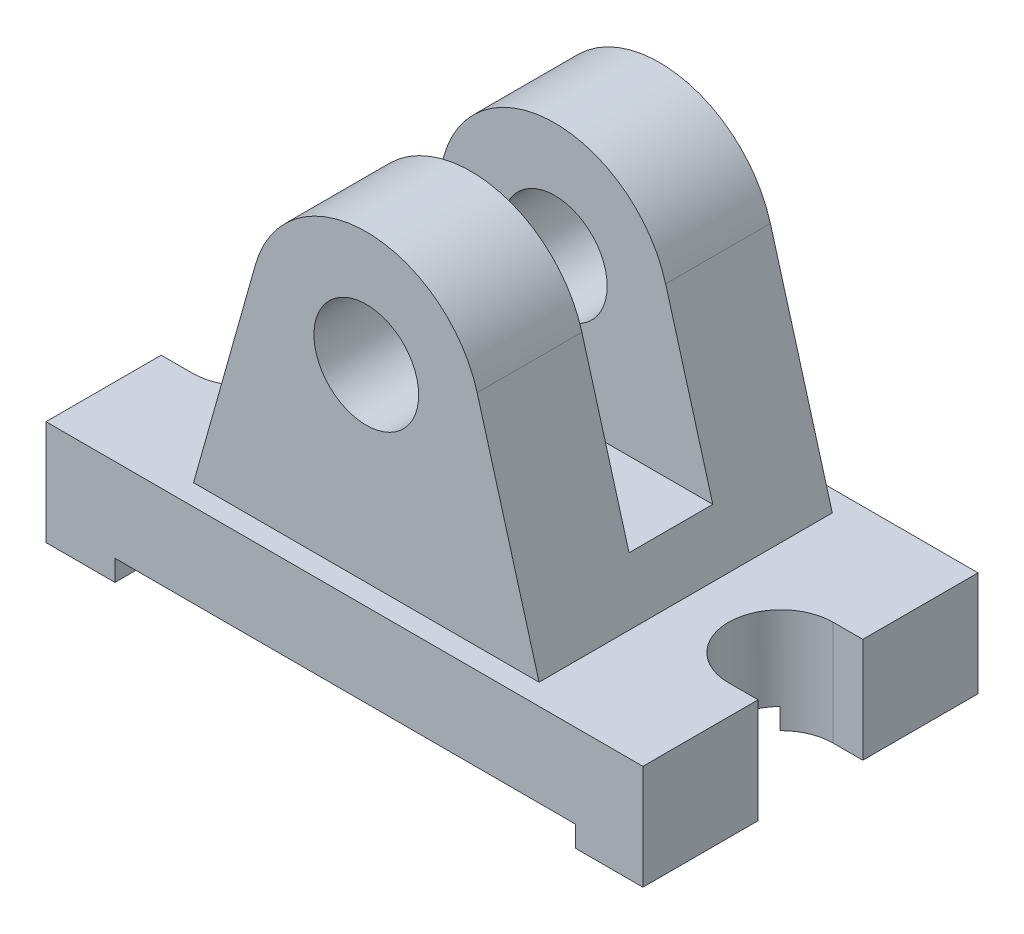
ISO-10303-21;
HEADER;
FILE_DESCRIPTION(('STEP AP214'),'2;1');
FILE_NAME('part.step','',(''),(''),'','','');
FILE_SCHEMA(('AUTOMOTIVE_DESIGN { 1 0 10303 214 1 1 1 1 }'));
ENDSEC;
DATA;
#1=APPLICATION_CONTEXT('core data for automotive mechanical design processes');
#2=APPLICATION_PROTOCOL_DEFINITION('international standard','automotive_design',2000,#1);
#3=PRODUCT_CONTEXT('',#1,'mechanical');
#4=PRODUCT('Part','Part','',(#3));
#5=PRODUCT_RELATED_PRODUCT_CATEGORY('part','',(#4));
#6=PRODUCT_DEFINITION_FORMATION('','',#4);
#7=PRODUCT_DEFINITION_CONTEXT('part definition',#1,'design');
#8=PRODUCT_DEFINITION('design','',#6,#7);
#9=PRODUCT_DEFINITION_SHAPE('','',#8);
#10=(LENGTH_UNIT() NAMED_UNIT(*) SI_UNIT(.MILLI.,.METRE.));
#11=(NAMED_UNIT(*) PLANE_ANGLE_UNIT() SI_UNIT($,.RADIAN.));
#12=(NAMED_UNIT(*) SI_UNIT($,.STERADIAN.) SOLID_ANGLE_UNIT());
#13=UNCERTAINTY_MEASURE_WITH_UNIT(LENGTH_MEASURE(1.E-05),#10,'distance_accuracy_value','');
#14=(GEOMETRIC_REPRESENTATION_CONTEXT(3) GLOBAL_UNCERTAINTY_ASSIGNED_CONTEXT((#13)) GLOBAL_UNIT_ASSIGNED_CONTEXT((#10,
#11,#12)) REPRESENTATION_CONTEXT('',''));
#15=CARTESIAN_POINT('',(0.,0.,0.));
#16=DIRECTION('',(0.,0.,1.));
#17=DIRECTION('',(1.,0.,0.));
#18=AXIS2_PLACEMENT_3D('',#15,#16,#17);
#19=CARTESIAN_POINT('',(0.,28.,-14.));
#20=DIRECTION('',(0.,0.,1.));
#21=DIRECTION('',(1.,0.,0.));
#22=AXIS2_PLACEMENT_3D('',#19,#20,#21);
#23=CYLINDRICAL_SURFACE('',#22,11.);
#24=CARTESIAN_POINT('',(0.,28.,4.));
#25=DIRECTION('',(0.,0.,-1.));
#26=DIRECTION('',(0.,1.,0.));
#27=AXIS2_PLACEMENT_3D('',#24,#25,#26);
#28=CIRCLE('',#27,11.);
#29=CARTESIAN_POINT('',(10.5877491196732,30.9832144708115,4.));
#30=VERTEX_POINT('',#29);
#31=CARTESIAN_POINT('',(-10.5877491196732,30.9832144708115,4.));
#32=VERTEX_POINT('',#31);
#33=EDGE_CURVE('E54',#30,#32,#28,.F.);
#34=ORIENTED_EDGE('',*,*,#33,.T.);
#35=DIRECTION('',(0.,0.,1.));
#36=VECTOR('',#35,1.);
#37=CARTESIAN_POINT('',(-10.5877491196732,30.9832144708115,-14.));
#38=LINE('',#37,#36);
#39=CARTESIAN_POINT('',(-10.5877491196732,30.9832144708115,14.));
#40=VERTEX_POINT('',#39);
#41=EDGE_CURVE('E304',#32,#40,#38,.T.);
#42=ORIENTED_EDGE('',*,*,#41,.T.);
#43=CARTESIAN_POINT('',(0.,28.,14.));
#44=DIRECTION('',(0.,0.,1.));
#45=DIRECTION('',(1.,0.,0.));
#46=AXIS2_PLACEMENT_3D('',#43,#44,#45);
#47=CIRCLE('',#46,11.);
#48=CARTESIAN_POINT('',(10.5877491196732,30.9832144708115,14.));
#49=VERTEX_POINT('',#48);
#50=EDGE_CURVE('E311',#49,#40,#47,.T.);
#51=ORIENTED_EDGE('',*,*,#50,.F.);
#52=DIRECTION('',(0.,0.,1.));
#53=VECTOR('',#52,1.);
#54=CARTESIAN_POINT('',(10.5877491196732,30.9832144708115,-14.));
#55=LINE('',#54,#53);
#56=EDGE_CURVE('E332',#30,#49,#55,.T.);
#57=ORIENTED_EDGE('',*,*,#56,.F.);
#58=EDGE_LOOP('',(#34,#42,#51,#57));
#59=FACE_BOUND('',#58,.T.);
#60=ADVANCED_FACE('F39',(#59),#23,.T.);
#61=CARTESIAN_POINT('',(0.,28.,-14.));
#62=DIRECTION('',(0.,0.,1.));
#63=DIRECTION('',(1.,0.,0.));
#64=AXIS2_PLACEMENT_3D('',#61,#62,#63);
#65=CYLINDRICAL_SURFACE('',#64,5.);
#66=CARTESIAN_POINT('',(0.,28.,14.));
#67=DIRECTION('',(0.,0.,1.));
#68=DIRECTION('',(1.,0.,0.));
#69=AXIS2_PLACEMENT_3D('',#66,#67,#68);
#70=CIRCLE('',#69,5.);
#71=CARTESIAN_POINT('',(5.,28.,14.));
#72=VERTEX_POINT('',#71);
#73=EDGE_CURVE('E314',#72,#72,#70,.T.);
#74=ORIENTED_EDGE('',*,*,#73,.T.);
#75=EDGE_LOOP('',(#74));
#76=FACE_BOUND('',#75,.T.);
#77=CARTESIAN_POINT('',(0.,28.,4.));
#78=DIRECTION('',(0.,0.,-1.));
#79=DIRECTION('',(0.,1.,0.));
#80=AXIS2_PLACEMENT_3D('',#77,#78,#79);
#81=CIRCLE('',#80,5.);
#82=CARTESIAN_POINT('',(0.,33.,4.));
#83=VERTEX_POINT('',#82);
#84=EDGE_CURVE('E431',#83,#83,#81,.F.);
#85=ORIENTED_EDGE('',*,*,#84,.F.);
#86=EDGE_LOOP('',(#85));
#87=FACE_BOUND('',#86,.T.);
#88=ADVANCED_FACE('F469',(#76,#87),#65,.F.);
#89=CARTESIAN_POINT('',(0.,10.,-16.));
#90=DIRECTION('',(0.,-1.,0.));
#91=DIRECTION('',(1.,0.,0.));
#92=AXIS2_PLACEMENT_3D('',#89,#90,#91);
#93=PLANE('',#92);
#94=DIRECTION('',(1.,0.,0.));
#95=VECTOR('',#94,1.);
#96=CARTESIAN_POINT('',(0.,10.,-14.));
#97=LINE('',#96,#95);
#98=CARTESIAN_POINT('',(-16.5,9.99999999999999,-14.));
#99=VERTEX_POINT('',#98);
#100=CARTESIAN_POINT('',(16.5,10.,-14.));
#101=VERTEX_POINT('',#100);
#102=EDGE_CURVE('E310',#99,#101,#97,.T.);
#103=ORIENTED_EDGE('',*,*,#102,.T.);
#104=DIRECTION('',(0.,0.,1.));
#105=VECTOR('',#104,1.);
#106=CARTESIAN_POINT('',(16.5,10.,-14.));
#107=LINE('',#106,#105);
#108=CARTESIAN_POINT('',(16.5,10.,14.));
#109=VERTEX_POINT('',#108);
#110=EDGE_CURVE('E329',#101,#109,#107,.T.);
#111=ORIENTED_EDGE('',*,*,#110,.T.);
#112=DIRECTION('',(1.,0.,0.));
#113=VECTOR('',#112,1.);
#114=CARTESIAN_POINT('',(0.,10.,14.));
#115=LINE('',#114,#113);
#116=CARTESIAN_POINT('',(-16.5,10.,14.));
#117=VERTEX_POINT('',#116);
#118=EDGE_CURVE('E317',#117,#109,#115,.T.);
#119=ORIENTED_EDGE('',*,*,#118,.F.);
#120=DIRECTION('',(0.,0.,1.));
#121=VECTOR('',#120,1.);
#122=CARTESIAN_POINT('',(-16.5,9.99999999999999,-14.));
#123=LINE('',#122,#121);
#124=EDGE_CURVE('E303',#99,#117,#123,.T.);
#125=ORIENTED_EDGE('',*,*,#124,.F.);
#126=EDGE_LOOP('',(#103,#111,#119,#125));
#127=FACE_BOUND('',#126,.T.);
#128=DIRECTION('',(-1.,0.,0.));
#129=VECTOR('',#128,1.);
#130=CARTESIAN_POINT('',(0.,10.,-5.));
#131=LINE('',#130,#129);
#132=CARTESIAN_POINT('',(28.4143754412008,10.,-5.));
#133=VERTEX_POINT('',#132);
#134=CARTESIAN_POINT('',(25.5856245587992,10.,-5.));
#135=VERTEX_POINT('',#134);
#136=EDGE_CURVE('E399',#133,#135,#131,.T.);
#137=ORIENTED_EDGE('',*,*,#136,.F.);
#138=DIRECTION('',(0.,0.,1.));
#139=VECTOR('',#138,1.);
#140=CARTESIAN_POINT('',(28.4143754412008,10.,-16.));
#141=LINE('',#140,#139);
#142=CARTESIAN_POINT('',(28.4143754412008,10.,-16.));
#143=VERTEX_POINT('',#142);
#144=EDGE_CURVE('E266',#143,#133,#141,.T.);
#145=ORIENTED_EDGE('',*,*,#144,.F.);
#146=DIRECTION('',(1.,0.,0.));
#147=VECTOR('',#146,1.);
#148=CARTESIAN_POINT('',(0.,10.,-16.));
#149=LINE('',#148,#147);
#150=CARTESIAN_POINT('',(-28.5856245587992,10.,-16.));
#151=VERTEX_POINT('',#150);
#152=EDGE_CURVE('E292',#151,#143,#149,.T.);
#153=ORIENTED_EDGE('',*,*,#152,.F.);
#154=DIRECTION('',(0.,0.,1.));
#155=VECTOR('',#154,1.);
#156=CARTESIAN_POINT('',(-28.5856245587992,10.,-16.));
#157=LINE('',#156,#155);
#158=CARTESIAN_POINT('',(-28.5856245587992,10.,-5.));
#159=VERTEX_POINT('',#158);
#160=EDGE_CURVE('E270',#151,#159,#157,.T.);
#161=ORIENTED_EDGE('',*,*,#160,.T.);
#162=DIRECTION('',(1.,0.,0.));
#163=VECTOR('',#162,1.);
#164=CARTESIAN_POINT('',(0.,10.,-5.));
#165=LINE('',#164,#163);
#166=CARTESIAN_POINT('',(-25.5856245587992,10.,-5.));
#167=VERTEX_POINT('',#166);
#168=EDGE_CURVE('E253',#159,#167,#165,.T.);
#169=ORIENTED_EDGE('',*,*,#168,.T.);
#170=CARTESIAN_POINT('',(-25.5856245587992,10.,0.));
#171=DIRECTION('',(0.,-1.,0.));
#172=DIRECTION('',(1.,0.,0.));
#173=AXIS2_PLACEMENT_3D('',#170,#171,#172);
#174=CIRCLE('',#173,5.);
#175=CARTESIAN_POINT('',(-25.5856245587992,10.,5.));
#176=VERTEX_POINT('',#175);
#177=EDGE_CURVE('E377',#167,#176,#174,.T.);
#178=ORIENTED_EDGE('',*,*,#177,.T.);
#179=DIRECTION('',(-1.,0.,0.));
#180=VECTOR('',#179,1.);
#181=CARTESIAN_POINT('',(0.,10.,4.99999999999998));
#182=LINE('',#181,#180);
#183=CARTESIAN_POINT('',(-28.5856245587992,10.,5.));
#184=VERTEX_POINT('',#183);
#185=EDGE_CURVE('E255',#176,#184,#182,.T.);
#186=ORIENTED_EDGE('',*,*,#185,.T.);
#187=CARTESIAN_POINT('',(-28.5856245587992,10.,16.));
#188=VERTEX_POINT('',#187);
#189=EDGE_CURVE('E269',#184,#188,#157,.T.);
#190=ORIENTED_EDGE('',*,*,#189,.T.);
#191=DIRECTION('',(1.,0.,0.));
#192=VECTOR('',#191,1.);
#193=CARTESIAN_POINT('',(0.,10.,16.));
#194=LINE('',#193,#192);
#195=CARTESIAN_POINT('',(28.4143754412008,10.,16.));
#196=VERTEX_POINT('',#195);
#197=EDGE_CURVE('E280',#188,#196,#194,.T.);
#198=ORIENTED_EDGE('',*,*,#197,.T.);
#199=CARTESIAN_POINT('',(28.4143754412008,10.,5.));
#200=VERTEX_POINT('',#199);
#201=EDGE_CURVE('E264',#200,#196,#141,.T.);
#202=ORIENTED_EDGE('',*,*,#201,.F.);
#203=DIRECTION('',(1.,0.,0.));
#204=VECTOR('',#203,1.);
#205=CARTESIAN_POINT('',(0.,10.,4.99999999999998));
#206=LINE('',#205,#204);
#207=CARTESIAN_POINT('',(25.5856245587992,10.,5.));
#208=VERTEX_POINT('',#207);
#209=EDGE_CURVE('E404',#208,#200,#206,.T.);
#210=ORIENTED_EDGE('',*,*,#209,.F.);
#211=CARTESIAN_POINT('',(25.5856245587992,10.,0.));
#212=DIRECTION('',(0.,-1.,0.));
#213=DIRECTION('',(1.,0.,0.));
#214=AXIS2_PLACEMENT_3D('',#211,#212,#213);
#215=CIRCLE('',#214,5.);
#216=EDGE_CURVE('E62',#135,#208,#215,.F.);
#217=ORIENTED_EDGE('',*,*,#216,.F.);
#218=EDGE_LOOP('',(#137,#145,#153,#161,#169,#178,#186,#190,#198,#202,#210,#217));
#219=FACE_BOUND('',#218,.T.);
#220=ADVANCED_FACE('F450',(#127,#219),#93,.F.);
#221=CARTESIAN_POINT('',(0.,0.,-16.));
#222=DIRECTION('',(0.,-1.,0.));
#223=DIRECTION('',(1.,0.,0.));
#224=AXIS2_PLACEMENT_3D('',#221,#222,#223);
#225=PLANE('',#224);
#226=DIRECTION('',(0.,0.,1.));
#227=VECTOR('',#226,1.);
#228=CARTESIAN_POINT('',(28.4143754412008,0.,-16.));
#229=LINE('',#228,#227);
#230=CARTESIAN_POINT('',(28.4143754412008,0.,-16.));
#231=VERTEX_POINT('',#230);
#232=CARTESIAN_POINT('',(28.4143754412008,0.,-5.));
#233=VERTEX_POINT('',#232);
#234=EDGE_CURVE('E261',#231,#233,#229,.T.);
#235=ORIENTED_EDGE('',*,*,#234,.T.);
#236=DIRECTION('',(-1.,0.,0.));
#237=VECTOR('',#236,1.);
#238=CARTESIAN_POINT('',(0.,0.,-5.));
#239=LINE('',#238,#237);
#240=CARTESIAN_POINT('',(25.5856245587992,0.,-5.));
#241=VERTEX_POINT('',#240);
#242=EDGE_CURVE('E402',#233,#241,#239,.T.);
#243=ORIENTED_EDGE('',*,*,#242,.T.);
#244=CARTESIAN_POINT('',(25.5856245587992,0.,0.));
#245=DIRECTION('',(0.,-1.,0.));
#246=DIRECTION('',(1.,0.,0.));
#247=AXIS2_PLACEMENT_3D('',#244,#245,#246);
#248=CIRCLE('',#247,5.);
#249=CARTESIAN_POINT('',(22.,0.,-3.4847233065677));
#250=VERTEX_POINT('',#249);
#251=EDGE_CURVE('E411',#241,#250,#248,.F.);
#252=ORIENTED_EDGE('',*,*,#251,.T.);
#253=DIRECTION('',(0.,0.,1.));
#254=VECTOR('',#253,1.);
#255=CARTESIAN_POINT('',(22.,0.,-16.));
#256=LINE('',#255,#254);
#257=CARTESIAN_POINT('',(22.,0.,-16.));
#258=VERTEX_POINT('',#257);
#259=EDGE_CURVE('E341',#258,#250,#256,.T.);
#260=ORIENTED_EDGE('',*,*,#259,.F.);
#261=DIRECTION('',(1.,0.,0.));
#262=VECTOR('',#261,1.);
#263=CARTESIAN_POINT('',(0.,0.,-16.));
#264=LINE('',#263,#262);
#265=EDGE_CURVE('E279',#258,#231,#264,.T.);
#266=ORIENTED_EDGE('',*,*,#265,.T.);
#267=EDGE_LOOP('',(#235,#243,#252,#260,#266));
#268=FACE_BOUND('',#267,.T.);
#269=ADVANCED_FACE('F41',(#268),#225,.T.);
#270=CARTESIAN_POINT('',(22.,0.,3.4847233065677));
#271=VERTEX_POINT('',#270);
#272=CARTESIAN_POINT('',(22.,0.,16.));
#273=VERTEX_POINT('',#272);
#274=EDGE_CURVE('E344',#271,#273,#256,.T.);
#275=ORIENTED_EDGE('',*,*,#274,.F.);
#276=CARTESIAN_POINT('',(25.5856245587992,0.,5.));
#277=VERTEX_POINT('',#276);
#278=EDGE_CURVE('E410',#271,#277,#248,.F.);
#279=ORIENTED_EDGE('',*,*,#278,.T.);
#280=DIRECTION('',(1.,0.,0.));
#281=VECTOR('',#280,1.);
#282=CARTESIAN_POINT('',(0.,0.,4.99999999999998));
#283=LINE('',#282,#281);
#284=CARTESIAN_POINT('',(28.4143754412008,0.,5.));
#285=VERTEX_POINT('',#284);
#286=EDGE_CURVE('E407',#277,#285,#283,.T.);
#287=ORIENTED_EDGE('',*,*,#286,.T.);
#288=CARTESIAN_POINT('',(28.4143754412008,0.,16.));
#289=VERTEX_POINT('',#288);
#290=EDGE_CURVE('E265',#285,#289,#229,.T.);
#291=ORIENTED_EDGE('',*,*,#290,.T.);
#292=DIRECTION('',(1.,0.,0.));
#293=VECTOR('',#292,1.);
#294=CARTESIAN_POINT('',(0.,0.,16.));
#295=LINE('',#294,#293);
#296=EDGE_CURVE('E289',#273,#289,#295,.T.);
#297=ORIENTED_EDGE('',*,*,#296,.F.);
#298=EDGE_LOOP('',(#275,#279,#287,#291,#297));
#299=FACE_BOUND('',#298,.T.);
#300=ADVANCED_FACE('F519',(#299),#225,.T.);
#301=CARTESIAN_POINT('',(28.4143754412008,0.,-16.));
#302=DIRECTION('',(1.,0.,0.));
#303=DIRECTION('',(0.,1.,0.));
#304=AXIS2_PLACEMENT_3D('',#301,#302,#303);
#305=PLANE('',#304);
#306=ORIENTED_EDGE('',*,*,#144,.T.);
#307=DIRECTION('',(0.,-1.,0.));
#308=VECTOR('',#307,1.);
#309=CARTESIAN_POINT('',(28.4143754412008,0.,-5.));
#310=LINE('',#309,#308);
#311=EDGE_CURVE('E230',#133,#233,#310,.T.);
#312=ORIENTED_EDGE('',*,*,#311,.T.);
#313=ORIENTED_EDGE('',*,*,#234,.F.);
#314=DIRECTION('',(0.,1.,0.));
#315=VECTOR('',#314,1.);
#316=CARTESIAN_POINT('',(28.4143754412008,0.,-16.));
#317=LINE('',#316,#315);
#318=EDGE_CURVE('E294',#231,#143,#317,.T.);
#319=ORIENTED_EDGE('',*,*,#318,.T.);
#320=EDGE_LOOP('',(#306,#312,#313,#319));
#321=FACE_BOUND('',#320,.T.);
#322=ADVANCED_FACE('F566',(#321),#305,.T.);
#323=ORIENTED_EDGE('',*,*,#290,.F.);
#324=DIRECTION('',(0.,1.,0.));
#325=VECTOR('',#324,1.);
#326=CARTESIAN_POINT('',(28.4143754412008,0.,5.));
#327=LINE('',#326,#325);
#328=EDGE_CURVE('E245',#285,#200,#327,.T.);
#329=ORIENTED_EDGE('',*,*,#328,.T.);
#330=ORIENTED_EDGE('',*,*,#201,.T.);
#331=DIRECTION('',(0.,1.,0.));
#332=VECTOR('',#331,1.);
#333=CARTESIAN_POINT('',(28.4143754412008,0.,16.));
#334=LINE('',#333,#332);
#335=EDGE_CURVE('E283',#289,#196,#334,.T.);
#336=ORIENTED_EDGE('',*,*,#335,.F.);
#337=EDGE_LOOP('',(#323,#329,#330,#336));
#338=FACE_BOUND('',#337,.T.);
#339=ADVANCED_FACE('F597',(#338),#305,.T.);
#340=CARTESIAN_POINT('',(22.,0.,-16.));
#341=DIRECTION('',(1.,0.,0.));
#342=DIRECTION('',(0.,0.,-1.));
#343=AXIS2_PLACEMENT_3D('',#340,#341,#342);
#344=PLANE('',#343);
#345=DIRECTION('',(0.,-1.,0.));
#346=VECTOR('',#345,1.);
#347=CARTESIAN_POINT('',(22.,107.647911169925,3.4847233065677));
#348=LINE('',#347,#346);
#349=CARTESIAN_POINT('',(22.,2.,3.4847233065677));
#350=VERTEX_POINT('',#349);
#351=EDGE_CURVE('E247',#271,#350,#348,.F.);
#352=ORIENTED_EDGE('',*,*,#351,.F.);
#353=ORIENTED_EDGE('',*,*,#274,.T.);
#354=DIRECTION('',(0.,1.,0.));
#355=VECTOR('',#354,1.);
#356=CARTESIAN_POINT('',(22.,0.,16.));
#357=LINE('',#356,#355);
#358=CARTESIAN_POINT('',(22.,2.,16.));
#359=VERTEX_POINT('',#358);
#360=EDGE_CURVE('E362',#273,#359,#357,.T.);
#361=ORIENTED_EDGE('',*,*,#360,.T.);
#362=DIRECTION('',(0.,0.,1.));
#363=VECTOR('',#362,1.);
#364=CARTESIAN_POINT('',(22.,2.,-16.));
#365=LINE('',#364,#363);
#366=EDGE_CURVE('E343',#350,#359,#365,.T.);
#367=ORIENTED_EDGE('',*,*,#366,.F.);
#368=EDGE_LOOP('',(#352,#353,#361,#367));
#369=FACE_BOUND('',#368,.T.);
#370=ADVANCED_FACE('F520',(#369),#344,.F.);
#371=DIRECTION('',(0.,-1.,0.));
#372=VECTOR('',#371,1.);
#373=CARTESIAN_POINT('',(22.,107.647911169925,-3.4847233065677));
#374=LINE('',#373,#372);
#375=CARTESIAN_POINT('',(22.,2.,-3.4847233065677));
#376=VERTEX_POINT('',#375);
#377=EDGE_CURVE('E250',#376,#250,#374,.T.);
#378=ORIENTED_EDGE('',*,*,#377,.F.);
#379=CARTESIAN_POINT('',(22.,2.,-16.));
#380=VERTEX_POINT('',#379);
#381=EDGE_CURVE('E345',#380,#376,#365,.T.);
#382=ORIENTED_EDGE('',*,*,#381,.F.);
#383=DIRECTION('',(0.,1.,0.));
#384=VECTOR('',#383,1.);
#385=CARTESIAN_POINT('',(22.,0.,-16.));
#386=LINE('',#385,#384);
#387=EDGE_CURVE('E358',#258,#380,#386,.T.);
#388=ORIENTED_EDGE('',*,*,#387,.F.);
#389=ORIENTED_EDGE('',*,*,#259,.T.);
#390=EDGE_LOOP('',(#378,#382,#388,#389));
#391=FACE_BOUND('',#390,.T.);
#392=ADVANCED_FACE('F510',(#391),#344,.F.);
#393=CARTESIAN_POINT('',(-28.5856245587992,0.,-16.));
#394=DIRECTION('',(1.,0.,0.));
#395=DIRECTION('',(0.,1.,0.));
#396=AXIS2_PLACEMENT_3D('',#393,#394,#395);
#397=PLANE('',#396);
#398=DIRECTION('',(0.,-1.,0.));
#399=VECTOR('',#398,1.);
#400=CARTESIAN_POINT('',(-28.5856245587992,95.1479111699253,-5.));
#401=LINE('',#400,#399);
#402=CARTESIAN_POINT('',(-28.5856245587992,0.,-5.));
#403=VERTEX_POINT('',#402);
#404=EDGE_CURVE('E389',#159,#403,#401,.T.);
#405=ORIENTED_EDGE('',*,*,#404,.F.);
#406=ORIENTED_EDGE('',*,*,#160,.F.);
#407=DIRECTION('',(0.,1.,0.));
#408=VECTOR('',#407,1.);
#409=CARTESIAN_POINT('',(-28.5856245587992,0.,-16.));
#410=LINE('',#409,#408);
#411=CARTESIAN_POINT('',(-28.5856245587992,0.,-16.));
#412=VERTEX_POINT('',#411);
#413=EDGE_CURVE('E290',#412,#151,#410,.T.);
#414=ORIENTED_EDGE('',*,*,#413,.F.);
#415=DIRECTION('',(0.,0.,1.));
#416=VECTOR('',#415,1.);
#417=CARTESIAN_POINT('',(-28.5856245587992,0.,-16.));
#418=LINE('',#417,#416);
#419=EDGE_CURVE('E260',#412,#403,#418,.T.);
#420=ORIENTED_EDGE('',*,*,#419,.T.);
#421=EDGE_LOOP('',(#405,#406,#414,#420));
#422=FACE_BOUND('',#421,.T.);
#423=ADVANCED_FACE('F499',(#422),#397,.F.);
#424=DIRECTION('',(1.,0.,0.));
#425=VECTOR('',#424,1.);
#426=CARTESIAN_POINT('',(0.,0.,-5.));
#427=LINE('',#426,#425);
#428=CARTESIAN_POINT('',(-25.5856245587992,0.,-5.));
#429=VERTEX_POINT('',#428);
#430=EDGE_CURVE('E365',#403,#429,#427,.T.);
#431=ORIENTED_EDGE('',*,*,#430,.F.);
#432=ORIENTED_EDGE('',*,*,#419,.F.);
#433=CARTESIAN_POINT('',(-22.,0.,-16.));
#434=VERTEX_POINT('',#433);
#435=EDGE_CURVE('E297',#412,#434,#264,.T.);
#436=ORIENTED_EDGE('',*,*,#435,.T.);
#437=DIRECTION('',(0.,0.,1.));
#438=VECTOR('',#437,1.);
#439=CARTESIAN_POINT('',(-22.,0.,-16.));
#440=LINE('',#439,#438);
#441=CARTESIAN_POINT('',(-22.,0.,-3.48472330656769));
#442=VERTEX_POINT('',#441);
#443=EDGE_CURVE('E338',#434,#442,#440,.T.);
#444=ORIENTED_EDGE('',*,*,#443,.T.);
#445=CARTESIAN_POINT('',(-25.5856245587992,0.,0.));
#446=DIRECTION('',(0.,-1.,0.));
#447=DIRECTION('',(1.,0.,0.));
#448=AXIS2_PLACEMENT_3D('',#445,#446,#447);
#449=CIRCLE('',#448,5.);
#450=EDGE_CURVE('E380',#429,#442,#449,.T.);
#451=ORIENTED_EDGE('',*,*,#450,.F.);
#452=EDGE_LOOP('',(#431,#432,#436,#444,#451));
#453=FACE_BOUND('',#452,.T.);
#454=ADVANCED_FACE('F509',(#453),#225,.T.);
#455=CARTESIAN_POINT('',(-22.,0.,-16.));
#456=DIRECTION('',(1.,0.,0.));
#457=DIRECTION('',(0.,0.,-1.));
#458=AXIS2_PLACEMENT_3D('',#455,#456,#457);
#459=PLANE('',#458);
#460=DIRECTION('',(0.,-1.,0.));
#461=VECTOR('',#460,1.);
#462=CARTESIAN_POINT('',(-22.,95.1479111699253,3.48472330656769));
#463=LINE('',#462,#461);
#464=CARTESIAN_POINT('',(-22.,2.,3.48472330656769));
#465=VERTEX_POINT('',#464);
#466=CARTESIAN_POINT('',(-22.,0.,3.48472330656769));
#467=VERTEX_POINT('',#466);
#468=EDGE_CURVE('E383',#465,#467,#463,.T.);
#469=ORIENTED_EDGE('',*,*,#468,.F.);
#470=DIRECTION('',(0.,0.,1.));
#471=VECTOR('',#470,1.);
#472=CARTESIAN_POINT('',(-22.,2.,-16.));
#473=LINE('',#472,#471);
#474=CARTESIAN_POINT('',(-22.,2.,16.));
#475=VERTEX_POINT('',#474);
#476=EDGE_CURVE('E348',#465,#475,#473,.T.);
#477=ORIENTED_EDGE('',*,*,#476,.T.);
#478=DIRECTION('',(0.,1.,0.));
#479=VECTOR('',#478,1.);
#480=CARTESIAN_POINT('',(-22.,0.,16.));
#481=LINE('',#480,#479);
#482=CARTESIAN_POINT('',(-22.,0.,16.));
#483=VERTEX_POINT('',#482);
#484=EDGE_CURVE('E355',#483,#475,#481,.T.);
#485=ORIENTED_EDGE('',*,*,#484,.F.);
#486=EDGE_CURVE('E352',#467,#483,#440,.T.);
#487=ORIENTED_EDGE('',*,*,#486,.F.);
#488=EDGE_LOOP('',(#469,#477,#485,#487));
#489=FACE_BOUND('',#488,.T.);
#490=ADVANCED_FACE('F516',(#489),#459,.T.);
#491=CARTESIAN_POINT('',(-25.5856245587992,0.,5.));
#492=VERTEX_POINT('',#491);
#493=EDGE_CURVE('E379',#467,#492,#449,.T.);
#494=ORIENTED_EDGE('',*,*,#493,.F.);
#495=ORIENTED_EDGE('',*,*,#486,.T.);
#496=CARTESIAN_POINT('',(-28.5856245587992,0.,16.));
#497=VERTEX_POINT('',#496);
#498=EDGE_CURVE('E286',#497,#483,#295,.T.);
#499=ORIENTED_EDGE('',*,*,#498,.F.);
#500=CARTESIAN_POINT('',(-28.5856245587992,0.,5.));
#501=VERTEX_POINT('',#500);
#502=EDGE_CURVE('E273',#501,#497,#418,.T.);
#503=ORIENTED_EDGE('',*,*,#502,.F.);
#504=DIRECTION('',(-1.,0.,0.));
#505=VECTOR('',#504,1.);
#506=CARTESIAN_POINT('',(0.,0.,4.99999999999998));
#507=LINE('',#506,#505);
#508=EDGE_CURVE('E374',#492,#501,#507,.T.);
#509=ORIENTED_EDGE('',*,*,#508,.F.);
#510=EDGE_LOOP('',(#494,#495,#499,#503,#509));
#511=FACE_BOUND('',#510,.T.);
#512=ADVANCED_FACE('F518',(#511),#225,.T.);
#513=CARTESIAN_POINT('',(0.,0.,-16.));
#514=DIRECTION('',(0.,0.,1.));
#515=DIRECTION('',(1.,0.,0.));
#516=AXIS2_PLACEMENT_3D('',#513,#514,#515);
#517=PLANE('',#516);
#518=DIRECTION('',(0.,1.,0.));
#519=VECTOR('',#518,1.);
#520=CARTESIAN_POINT('',(-22.,0.,-16.));
#521=LINE('',#520,#519);
#522=CARTESIAN_POINT('',(-22.,2.,-16.));
#523=VERTEX_POINT('',#522);
#524=EDGE_CURVE('E366',#434,#523,#521,.T.);
#525=ORIENTED_EDGE('',*,*,#524,.F.);
#526=ORIENTED_EDGE('',*,*,#435,.F.);
#527=ORIENTED_EDGE('',*,*,#413,.T.);
#528=ORIENTED_EDGE('',*,*,#152,.T.);
#529=ORIENTED_EDGE('',*,*,#318,.F.);
#530=ORIENTED_EDGE('',*,*,#265,.F.);
#531=ORIENTED_EDGE('',*,*,#387,.T.);
#532=DIRECTION('',(1.,0.,0.));
#533=VECTOR('',#532,1.);
#534=CARTESIAN_POINT('',(-22.,2.,-16.));
#535=LINE('',#534,#533);
#536=EDGE_CURVE('E368',#523,#380,#535,.T.);
#537=ORIENTED_EDGE('',*,*,#536,.F.);
#538=EDGE_LOOP('',(#525,#526,#527,#528,#529,#530,#531,#537));
#539=FACE_BOUND('',#538,.T.);
#540=ADVANCED_FACE('F503',(#539),#517,.F.);
#541=CARTESIAN_POINT('',(0.,0.,16.));
#542=DIRECTION('',(0.,0.,1.));
#543=DIRECTION('',(1.,0.,0.));
#544=AXIS2_PLACEMENT_3D('',#541,#542,#543);
#545=PLANE('',#544);
#546=ORIENTED_EDGE('',*,*,#498,.T.);
#547=ORIENTED_EDGE('',*,*,#484,.T.);
#548=DIRECTION('',(1.,0.,0.));
#549=VECTOR('',#548,1.);
#550=CARTESIAN_POINT('',(-22.,2.,16.));
#551=LINE('',#550,#549);
#552=EDGE_CURVE('E359',#475,#359,#551,.T.);
#553=ORIENTED_EDGE('',*,*,#552,.T.);
#554=ORIENTED_EDGE('',*,*,#360,.F.);
#555=ORIENTED_EDGE('',*,*,#296,.T.);
#556=ORIENTED_EDGE('',*,*,#335,.T.);
#557=ORIENTED_EDGE('',*,*,#197,.F.);
#558=DIRECTION('',(0.,1.,0.));
#559=VECTOR('',#558,1.);
#560=CARTESIAN_POINT('',(-28.5856245587992,0.,16.));
#561=LINE('',#560,#559);
#562=EDGE_CURVE('E276',#497,#188,#561,.T.);
#563=ORIENTED_EDGE('',*,*,#562,.F.);
#564=EDGE_LOOP('',(#546,#547,#553,#554,#555,#556,#557,#563));
#565=FACE_BOUND('',#564,.T.);
#566=ADVANCED_FACE('F496',(#565),#545,.T.);
#567=ORIENTED_EDGE('',*,*,#189,.F.);
#568=DIRECTION('',(0.,-1.,0.));
#569=VECTOR('',#568,1.);
#570=CARTESIAN_POINT('',(-28.5856245587992,95.1479111699253,5.));
#571=LINE('',#570,#569);
#572=EDGE_CURVE('E395',#184,#501,#571,.T.);
#573=ORIENTED_EDGE('',*,*,#572,.T.);
#574=ORIENTED_EDGE('',*,*,#502,.T.);
#575=ORIENTED_EDGE('',*,*,#562,.T.);
#576=EDGE_LOOP('',(#567,#573,#574,#575));
#577=FACE_BOUND('',#576,.T.);
#578=ADVANCED_FACE('F492',(#577),#397,.F.);
#579=CARTESIAN_POINT('',(-17.8967965481003,5.04261877005174,-14.));
#580=DIRECTION('',(0.962522647243018,-0.271201315528322,0.));
#581=DIRECTION('',(0.271201315528322,0.962522647243018,0.));
#582=AXIS2_PLACEMENT_3D('',#579,#580,#581);
#583=PLANE('',#582);
#584=DIRECTION('',(0.,0.,1.));
#585=VECTOR('',#584,1.);
#586=CARTESIAN_POINT('',(-15.0911951458746,15.,-14.));
#587=LINE('',#586,#585);
#588=CARTESIAN_POINT('',(-15.0911951458746,15.,-4.));
#589=VERTEX_POINT('',#588);
#590=CARTESIAN_POINT('',(-15.0911951458746,15.,4.));
#591=VERTEX_POINT('',#590);
#592=EDGE_CURVE('E237',#589,#591,#587,.T.);
#593=ORIENTED_EDGE('',*,*,#592,.F.);
#594=DIRECTION('',(0.271201315528322,0.962522647243018,0.));
#595=VECTOR('',#594,1.);
#596=CARTESIAN_POINT('',(-17.8967965481003,5.04261877005174,-4.));
#597=LINE('',#596,#595);
#598=CARTESIAN_POINT('',(-10.5877491196732,30.9832144708115,-4.));
#599=VERTEX_POINT('',#598);
#600=EDGE_CURVE('E426',#589,#599,#597,.T.);
#601=ORIENTED_EDGE('',*,*,#600,.T.);
#602=CARTESIAN_POINT('',(-10.5877491196732,30.9832144708115,-14.));
#603=VERTEX_POINT('',#602);
#604=EDGE_CURVE('E300',#603,#599,#38,.T.);
#605=ORIENTED_EDGE('',*,*,#604,.F.);
#606=DIRECTION('',(0.271201315528322,0.962522647243018,0.));
#607=VECTOR('',#606,1.);
#608=CARTESIAN_POINT('',(-17.8967965481003,5.04261877005174,-14.));
#609=LINE('',#608,#607);
#610=EDGE_CURVE('E320',#99,#603,#609,.T.);
#611=ORIENTED_EDGE('',*,*,#610,.F.);
#612=ORIENTED_EDGE('',*,*,#124,.T.);
#613=DIRECTION('',(0.271201315528322,0.962522647243018,0.));
#614=VECTOR('',#613,1.);
#615=CARTESIAN_POINT('',(-17.8967965481003,5.04261877005174,14.));
#616=LINE('',#615,#614);
#617=EDGE_CURVE('E307',#117,#40,#616,.T.);
#618=ORIENTED_EDGE('',*,*,#617,.T.);
#619=ORIENTED_EDGE('',*,*,#41,.F.);
#620=DIRECTION('',(0.271201315528322,0.962522647243018,0.));
#621=VECTOR('',#620,1.);
#622=CARTESIAN_POINT('',(-17.8967965481003,5.04261877005174,4.00000000000001));
#623=LINE('',#622,#621);
#624=EDGE_CURVE('E434',#591,#32,#623,.T.);
#625=ORIENTED_EDGE('',*,*,#624,.F.);
#626=EDGE_LOOP('',(#593,#601,#605,#611,#612,#618,#619,#625));
#627=FACE_BOUND('',#626,.T.);
#628=ADVANCED_FACE('F439',(#627),#583,.F.);
#629=ORIENTED_EDGE('',*,*,#604,.T.);
#630=CARTESIAN_POINT('',(0.,28.,-4.));
#631=DIRECTION('',(0.,0.,-1.));
#632=DIRECTION('',(0.,1.,0.));
#633=AXIS2_PLACEMENT_3D('',#630,#631,#632);
#634=CIRCLE('',#633,11.);
#635=CARTESIAN_POINT('',(10.5877491196732,30.9832144708115,-4.));
#636=VERTEX_POINT('',#635);
#637=EDGE_CURVE('E429',#636,#599,#634,.F.);
#638=ORIENTED_EDGE('',*,*,#637,.F.);
#639=CARTESIAN_POINT('',(10.5877491196732,30.9832144708115,-14.));
#640=VERTEX_POINT('',#639);
#641=EDGE_CURVE('E319',#640,#636,#55,.T.);
#642=ORIENTED_EDGE('',*,*,#641,.F.);
#643=CARTESIAN_POINT('',(0.,28.,-14.));
#644=DIRECTION('',(0.,0.,1.));
#645=DIRECTION('',(1.,0.,0.));
#646=AXIS2_PLACEMENT_3D('',#643,#644,#645);
#647=CIRCLE('',#646,11.);
#648=EDGE_CURVE('E322',#640,#603,#647,.T.);
#649=ORIENTED_EDGE('',*,*,#648,.T.);
#650=EDGE_LOOP('',(#629,#638,#642,#649));
#651=FACE_BOUND('',#650,.T.);
#652=ADVANCED_FACE('F458',(#651),#23,.T.);
#653=CARTESIAN_POINT('',(0.,28.,-4.));
#654=DIRECTION('',(0.,0.,-1.));
#655=DIRECTION('',(0.,1.,0.));
#656=AXIS2_PLACEMENT_3D('',#653,#654,#655);
#657=CIRCLE('',#656,5.);
#658=CARTESIAN_POINT('',(0.,33.,-4.));
#659=VERTEX_POINT('',#658);
#660=EDGE_CURVE('E423',#659,#659,#657,.F.);
#661=ORIENTED_EDGE('',*,*,#660,.T.);
#662=EDGE_LOOP('',(#661));
#663=FACE_BOUND('',#662,.T.);
#664=CARTESIAN_POINT('',(0.,28.,-14.));
#665=DIRECTION('',(0.,0.,1.));
#666=DIRECTION('',(1.,0.,0.));
#667=AXIS2_PLACEMENT_3D('',#664,#665,#666);
#668=CIRCLE('',#667,5.);
#669=CARTESIAN_POINT('',(5.,28.,-14.));
#670=VERTEX_POINT('',#669);
#671=EDGE_CURVE('E325',#670,#670,#668,.T.);
#672=ORIENTED_EDGE('',*,*,#671,.F.);
#673=EDGE_LOOP('',(#672));
#674=FACE_BOUND('',#673,.T.);
#675=ADVANCED_FACE('F465',(#663,#674),#65,.F.);
#676=CARTESIAN_POINT('',(0.,0.,-14.));
#677=DIRECTION('',(0.,0.,1.));
#678=DIRECTION('',(1.,0.,0.));
#679=AXIS2_PLACEMENT_3D('',#676,#677,#678);
#680=PLANE('',#679);
#681=ORIENTED_EDGE('',*,*,#671,.T.);
#682=EDGE_LOOP('',(#681));
#683=FACE_BOUND('',#682,.T.);
#684=ORIENTED_EDGE('',*,*,#102,.F.);
#685=ORIENTED_EDGE('',*,*,#610,.T.);
#686=ORIENTED_EDGE('',*,*,#648,.F.);
#687=DIRECTION('',(-0.271201315528323,0.962522647243018,0.));
#688=VECTOR('',#687,1.);
#689=CARTESIAN_POINT('',(17.8967965481003,5.04261877005174,-14.));
#690=LINE('',#689,#688);
#691=EDGE_CURVE('E333',#101,#640,#690,.T.);
#692=ORIENTED_EDGE('',*,*,#691,.F.);
#693=EDGE_LOOP('',(#684,#685,#686,#692));
#694=FACE_BOUND('',#693,.T.);
#695=ADVANCED_FACE('F454',(#683,#694),#680,.F.);
#696=CARTESIAN_POINT('',(0.,0.,14.));
#697=DIRECTION('',(0.,0.,1.));
#698=DIRECTION('',(1.,0.,0.));
#699=AXIS2_PLACEMENT_3D('',#696,#697,#698);
#700=PLANE('',#699);
#701=ORIENTED_EDGE('',*,*,#73,.F.);
#702=EDGE_LOOP('',(#701));
#703=FACE_BOUND('',#702,.T.);
#704=ORIENTED_EDGE('',*,*,#118,.T.);
#705=DIRECTION('',(-0.271201315528323,0.962522647243018,0.));
#706=VECTOR('',#705,1.);
#707=CARTESIAN_POINT('',(17.8967965481003,5.04261877005174,14.));
#708=LINE('',#707,#706);
#709=EDGE_CURVE('E335',#109,#49,#708,.T.);
#710=ORIENTED_EDGE('',*,*,#709,.T.);
#711=ORIENTED_EDGE('',*,*,#50,.T.);
#712=ORIENTED_EDGE('',*,*,#617,.F.);
#713=EDGE_LOOP('',(#704,#710,#711,#712));
#714=FACE_BOUND('',#713,.T.);
#715=ADVANCED_FACE('F473',(#703,#714),#700,.T.);
#716=CARTESIAN_POINT('',(17.8967965481003,5.04261877005174,-14.));
#717=DIRECTION('',(0.962522647243018,0.271201315528323,0.));
#718=DIRECTION('',(-0.271201315528323,0.962522647243018,0.));
#719=AXIS2_PLACEMENT_3D('',#716,#717,#718);
#720=PLANE('',#719);
#721=DIRECTION('',(-0.271201315528323,0.962522647243018,0.));
#722=VECTOR('',#721,1.);
#723=CARTESIAN_POINT('',(17.8967965481003,5.04261877005174,-4.));
#724=LINE('',#723,#722);
#725=CARTESIAN_POINT('',(15.0911951458746,15.,-4.));
#726=VERTEX_POINT('',#725);
#727=EDGE_CURVE('E11',#726,#636,#724,.T.);
#728=ORIENTED_EDGE('',*,*,#727,.F.);
#729=DIRECTION('',(0.,0.,1.));
#730=VECTOR('',#729,1.);
#731=CARTESIAN_POINT('',(15.0911951458746,15.,-14.));
#732=LINE('',#731,#730);
#733=CARTESIAN_POINT('',(15.0911951458746,15.,4.));
#734=VERTEX_POINT('',#733);
#735=EDGE_CURVE('E47',#726,#734,#732,.T.);
#736=ORIENTED_EDGE('',*,*,#735,.T.);
#737=DIRECTION('',(-0.271201315528323,0.962522647243018,0.));
#738=VECTOR('',#737,1.);
#739=CARTESIAN_POINT('',(17.8967965481003,5.04261877005175,4.00000000000001));
#740=LINE('',#739,#738);
#741=EDGE_CURVE('E221',#734,#30,#740,.T.);
#742=ORIENTED_EDGE('',*,*,#741,.T.);
#743=ORIENTED_EDGE('',*,*,#56,.T.);
#744=ORIENTED_EDGE('',*,*,#709,.F.);
#745=ORIENTED_EDGE('',*,*,#110,.F.);
#746=ORIENTED_EDGE('',*,*,#691,.T.);
#747=ORIENTED_EDGE('',*,*,#641,.T.);
#748=EDGE_LOOP('',(#728,#736,#742,#743,#744,#745,#746,#747));
#749=FACE_BOUND('',#748,.T.);
#750=ADVANCED_FACE('F241',(#749),#720,.T.);
#751=DIRECTION('',(0.,-1.,0.));
#752=VECTOR('',#751,1.);
#753=CARTESIAN_POINT('',(-22.,95.1479111699253,-3.48472330656769));
#754=LINE('',#753,#752);
#755=CARTESIAN_POINT('',(-22.,2.,-3.48472330656769));
#756=VERTEX_POINT('',#755);
#757=EDGE_CURVE('E386',#442,#756,#754,.F.);
#758=ORIENTED_EDGE('',*,*,#757,.F.);
#759=ORIENTED_EDGE('',*,*,#443,.F.);
#760=ORIENTED_EDGE('',*,*,#524,.T.);
#761=EDGE_CURVE('E349',#523,#756,#473,.T.);
#762=ORIENTED_EDGE('',*,*,#761,.T.);
#763=EDGE_LOOP('',(#758,#759,#760,#762));
#764=FACE_BOUND('',#763,.T.);
#765=ADVANCED_FACE('F575',(#764),#459,.T.);
#766=CARTESIAN_POINT('',(-22.,2.,-16.));
#767=DIRECTION('',(0.,-1.,0.));
#768=DIRECTION('',(0.,0.,-1.));
#769=AXIS2_PLACEMENT_3D('',#766,#767,#768);
#770=PLANE('',#769);
#771=ORIENTED_EDGE('',*,*,#381,.T.);
#772=CARTESIAN_POINT('',(25.5856245587992,2.,0.));
#773=DIRECTION('',(0.,-1.,0.));
#774=DIRECTION('',(0.,0.,-1.));
#775=AXIS2_PLACEMENT_3D('',#772,#773,#774);
#776=CIRCLE('',#775,5.);
#777=EDGE_CURVE('E414',#376,#350,#776,.F.);
#778=ORIENTED_EDGE('',*,*,#777,.T.);
#779=ORIENTED_EDGE('',*,*,#366,.T.);
#780=ORIENTED_EDGE('',*,*,#552,.F.);
#781=ORIENTED_EDGE('',*,*,#476,.F.);
#782=CARTESIAN_POINT('',(-25.5856245587992,2.,0.));
#783=DIRECTION('',(0.,-1.,0.));
#784=DIRECTION('',(0.,0.,-1.));
#785=AXIS2_PLACEMENT_3D('',#782,#783,#784);
#786=CIRCLE('',#785,5.);
#787=EDGE_CURVE('E257',#756,#465,#786,.T.);
#788=ORIENTED_EDGE('',*,*,#787,.F.);
#789=ORIENTED_EDGE('',*,*,#761,.F.);
#790=ORIENTED_EDGE('',*,*,#536,.T.);
#791=EDGE_LOOP('',(#771,#778,#779,#780,#781,#788,#789,#790));
#792=FACE_BOUND('',#791,.T.);
#793=ADVANCED_FACE('F579',(#792),#770,.T.);
#794=CARTESIAN_POINT('',(-28.5856245587992,95.1479111699253,-5.));
#795=DIRECTION('',(0.,0.,-1.));
#796=DIRECTION('',(-1.,0.,0.));
#797=AXIS2_PLACEMENT_3D('',#794,#795,#796);
#798=PLANE('',#797);
#799=ORIENTED_EDGE('',*,*,#404,.T.);
#800=ORIENTED_EDGE('',*,*,#430,.T.);
#801=DIRECTION('',(0.,-1.,0.));
#802=VECTOR('',#801,1.);
#803=CARTESIAN_POINT('',(-25.5856245587992,95.1479111699253,-5.));
#804=LINE('',#803,#802);
#805=EDGE_CURVE('E392',#167,#429,#804,.T.);
#806=ORIENTED_EDGE('',*,*,#805,.F.);
#807=ORIENTED_EDGE('',*,*,#168,.F.);
#808=EDGE_LOOP('',(#799,#800,#806,#807));
#809=FACE_BOUND('',#808,.T.);
#810=ADVANCED_FACE('F531',(#809),#798,.F.);
#811=CARTESIAN_POINT('',(-28.5856245587992,95.1479111699253,5.));
#812=DIRECTION('',(0.,0.,1.));
#813=DIRECTION('',(1.,0.,0.));
#814=AXIS2_PLACEMENT_3D('',#811,#812,#813);
#815=PLANE('',#814);
#816=DIRECTION('',(0.,-1.,0.));
#817=VECTOR('',#816,1.);
#818=CARTESIAN_POINT('',(-25.5856245587992,95.1479111699253,5.));
#819=LINE('',#818,#817);
#820=EDGE_CURVE('E396',#176,#492,#819,.T.);
#821=ORIENTED_EDGE('',*,*,#820,.T.);
#822=ORIENTED_EDGE('',*,*,#508,.T.);
#823=ORIENTED_EDGE('',*,*,#572,.F.);
#824=ORIENTED_EDGE('',*,*,#185,.F.);
#825=EDGE_LOOP('',(#821,#822,#823,#824));
#826=FACE_BOUND('',#825,.T.);
#827=ADVANCED_FACE('F539',(#826),#815,.F.);
#828=CARTESIAN_POINT('',(-25.5856245587992,95.1479111699253,0.));
#829=DIRECTION('',(0.,-1.,0.));
#830=DIRECTION('',(0.,0.,-1.));
#831=AXIS2_PLACEMENT_3D('',#828,#829,#830);
#832=CYLINDRICAL_SURFACE('',#831,5.);
#833=ORIENTED_EDGE('',*,*,#177,.F.);
#834=ORIENTED_EDGE('',*,*,#805,.T.);
#835=ORIENTED_EDGE('',*,*,#450,.T.);
#836=ORIENTED_EDGE('',*,*,#757,.T.);
#837=ORIENTED_EDGE('',*,*,#787,.T.);
#838=ORIENTED_EDGE('',*,*,#468,.T.);
#839=ORIENTED_EDGE('',*,*,#493,.T.);
#840=ORIENTED_EDGE('',*,*,#820,.F.);
#841=EDGE_LOOP('',(#833,#834,#835,#836,#837,#838,#839,#840));
#842=FACE_BOUND('',#841,.T.);
#843=ADVANCED_FACE('F533',(#842),#832,.F.);
#844=CARTESIAN_POINT('',(28.5856245587992,107.647911169925,-5.));
#845=DIRECTION('',(0.,0.,1.));
#846=DIRECTION('',(1.,0.,0.));
#847=AXIS2_PLACEMENT_3D('',#844,#845,#846);
#848=PLANE('',#847);
#849=ORIENTED_EDGE('',*,*,#311,.F.);
#850=ORIENTED_EDGE('',*,*,#136,.T.);
#851=DIRECTION('',(0.,-1.,0.));
#852=VECTOR('',#851,1.);
#853=CARTESIAN_POINT('',(25.5856245587992,107.647911169925,-5.));
#854=LINE('',#853,#852);
#855=EDGE_CURVE('E416',#135,#241,#854,.T.);
#856=ORIENTED_EDGE('',*,*,#855,.T.);
#857=ORIENTED_EDGE('',*,*,#242,.F.);
#858=EDGE_LOOP('',(#849,#850,#856,#857));
#859=FACE_BOUND('',#858,.T.);
#860=ADVANCED_FACE('F564',(#859),#848,.T.);
#861=CARTESIAN_POINT('',(28.5856245587992,107.647911169925,5.));
#862=DIRECTION('',(0.,0.,-1.));
#863=DIRECTION('',(-1.,0.,0.));
#864=AXIS2_PLACEMENT_3D('',#861,#862,#863);
#865=PLANE('',#864);
#866=DIRECTION('',(0.,-1.,0.));
#867=VECTOR('',#866,1.);
#868=CARTESIAN_POINT('',(25.5856245587992,107.647911169925,5.));
#869=LINE('',#868,#867);
#870=EDGE_CURVE('E419',#208,#277,#869,.T.);
#871=ORIENTED_EDGE('',*,*,#870,.F.);
#872=ORIENTED_EDGE('',*,*,#209,.T.);
#873=ORIENTED_EDGE('',*,*,#328,.F.);
#874=ORIENTED_EDGE('',*,*,#286,.F.);
#875=EDGE_LOOP('',(#871,#872,#873,#874));
#876=FACE_BOUND('',#875,.T.);
#877=ADVANCED_FACE('F554',(#876),#865,.T.);
#878=CARTESIAN_POINT('',(25.5856245587992,107.647911169925,0.));
#879=DIRECTION('',(0.,-1.,0.));
#880=DIRECTION('',(0.,0.,-1.));
#881=AXIS2_PLACEMENT_3D('',#878,#879,#880);
#882=CYLINDRICAL_SURFACE('',#881,5.);
#883=ORIENTED_EDGE('',*,*,#855,.F.);
#884=ORIENTED_EDGE('',*,*,#216,.T.);
#885=ORIENTED_EDGE('',*,*,#870,.T.);
#886=ORIENTED_EDGE('',*,*,#278,.F.);
#887=ORIENTED_EDGE('',*,*,#351,.T.);
#888=ORIENTED_EDGE('',*,*,#777,.F.);
#889=ORIENTED_EDGE('',*,*,#377,.T.);
#890=ORIENTED_EDGE('',*,*,#251,.F.);
#891=EDGE_LOOP('',(#883,#884,#885,#886,#887,#888,#889,#890));
#892=FACE_BOUND('',#891,.T.);
#893=ADVANCED_FACE('F559',(#892),#882,.F.);
#894=CARTESIAN_POINT('',(20.,15.,4.));
#895=DIRECTION('',(0.,1.,0.));
#896=DIRECTION('',(0.,0.,1.));
#897=AXIS2_PLACEMENT_3D('',#894,#895,#896);
#898=PLANE('',#897);
#899=ORIENTED_EDGE('',*,*,#592,.T.);
#900=DIRECTION('',(-1.,0.,0.));
#901=VECTOR('',#900,1.);
#902=CARTESIAN_POINT('',(20.,15.,4.));
#903=LINE('',#902,#901);
#904=EDGE_CURVE('E225',#734,#591,#903,.T.);
#905=ORIENTED_EDGE('',*,*,#904,.F.);
#906=ORIENTED_EDGE('',*,*,#735,.F.);
#907=DIRECTION('',(-1.,0.,0.));
#908=VECTOR('',#907,1.);
#909=CARTESIAN_POINT('',(20.,15.,-4.));
#910=LINE('',#909,#908);
#911=EDGE_CURVE('E238',#726,#589,#910,.T.);
#912=ORIENTED_EDGE('',*,*,#911,.T.);
#913=EDGE_LOOP('',(#899,#905,#906,#912));
#914=FACE_BOUND('',#913,.T.);
#915=ADVANCED_FACE('F233',(#914),#898,.T.);
#916=CARTESIAN_POINT('',(20.,39.,-4.));
#917=DIRECTION('',(0.,0.,-1.));
#918=DIRECTION('',(0.,1.,0.));
#919=AXIS2_PLACEMENT_3D('',#916,#917,#918);
#920=PLANE('',#919);
#921=ORIENTED_EDGE('',*,*,#911,.F.);
#922=ORIENTED_EDGE('',*,*,#727,.T.);
#923=ORIENTED_EDGE('',*,*,#637,.T.);
#924=ORIENTED_EDGE('',*,*,#600,.F.);
#925=EDGE_LOOP('',(#921,#922,#923,#924));
#926=FACE_BOUND('',#925,.T.);
#927=ORIENTED_EDGE('',*,*,#660,.F.);
#928=EDGE_LOOP('',(#927));
#929=FACE_BOUND('',#928,.T.);
#930=ADVANCED_FACE('F459',(#926,#929),#920,.F.);
#931=CARTESIAN_POINT('',(20.,39.,4.));
#932=DIRECTION('',(0.,0.,-1.));
#933=DIRECTION('',(0.,1.,0.));
#934=AXIS2_PLACEMENT_3D('',#931,#932,#933);
#935=PLANE('',#934);
#936=ORIENTED_EDGE('',*,*,#624,.T.);
#937=ORIENTED_EDGE('',*,*,#33,.F.);
#938=ORIENTED_EDGE('',*,*,#741,.F.);
#939=ORIENTED_EDGE('',*,*,#904,.T.);
#940=EDGE_LOOP('',(#936,#937,#938,#939));
#941=FACE_BOUND('',#940,.T.);
#942=ORIENTED_EDGE('',*,*,#84,.T.);
#943=EDGE_LOOP('',(#942));
#944=FACE_BOUND('',#943,.T.);
#945=ADVANCED_FACE('F223',(#941,#944),#935,.T.);
#946=CLOSED_SHELL('',(#60,#88,#220,#269,#300,#322,#339,#370,#392,#423,#454,#490,#512,#540,#566,
#578,#628,#652,#675,#695,#715,#750,#765,#793,#810,#827,#843,#860,#877,#893,#915,#930,#945));
#947=MANIFOLD_SOLID_BREP('B2',#946);
#948=ADVANCED_BREP_SHAPE_REPRESENTATION('',(#18,#947),#14);
#949=SHAPE_DEFINITION_REPRESENTATION(#9,#948);
ENDSEC;
END-ISO-10303-21;
